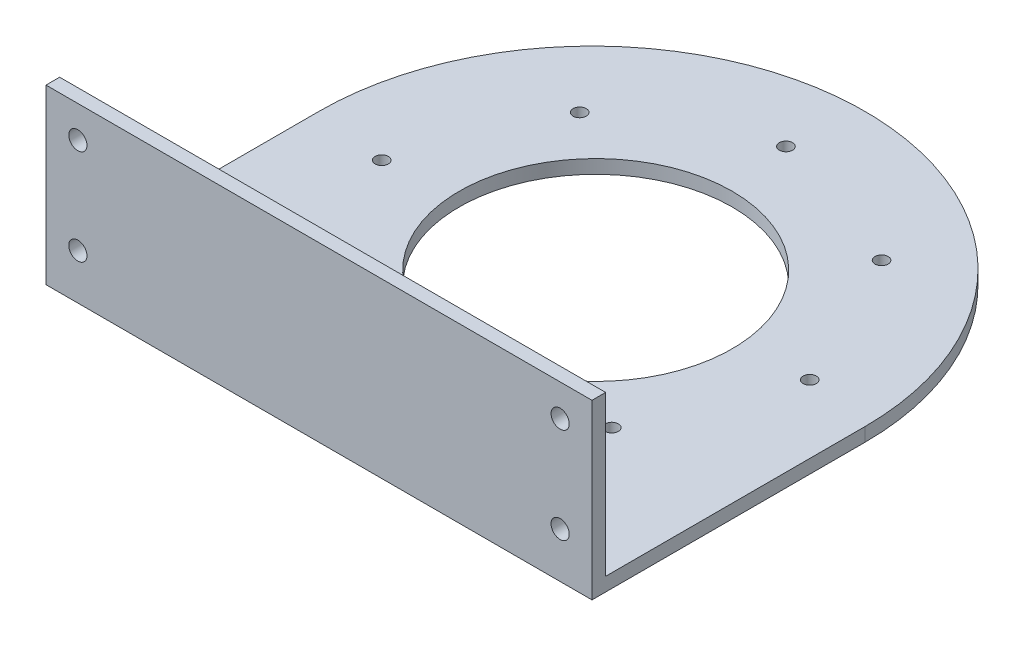
ISO-10303-21;
HEADER;
FILE_DESCRIPTION(('STEP AP214'),'2;1');
FILE_NAME('part.step','',(''),(''),'','','');
FILE_SCHEMA(('AUTOMOTIVE_DESIGN { 1 0 10303 214 1 1 1 1 }'));
ENDSEC;
DATA;
#1=APPLICATION_CONTEXT('core data for automotive mechanical design processes');
#2=APPLICATION_PROTOCOL_DEFINITION('international standard','automotive_design',2000,#1);
#3=PRODUCT_CONTEXT('',#1,'mechanical');
#4=PRODUCT('Part','Part','',(#3));
#5=PRODUCT_RELATED_PRODUCT_CATEGORY('part','',(#4));
#6=PRODUCT_DEFINITION_FORMATION('','',#4);
#7=PRODUCT_DEFINITION_CONTEXT('part definition',#1,'design');
#8=PRODUCT_DEFINITION('design','',#6,#7);
#9=PRODUCT_DEFINITION_SHAPE('','',#8);
#10=(LENGTH_UNIT() NAMED_UNIT(*) SI_UNIT(.MILLI.,.METRE.));
#11=(NAMED_UNIT(*) PLANE_ANGLE_UNIT() SI_UNIT($,.RADIAN.));
#12=(NAMED_UNIT(*) SI_UNIT($,.STERADIAN.) SOLID_ANGLE_UNIT());
#13=UNCERTAINTY_MEASURE_WITH_UNIT(LENGTH_MEASURE(1.E-05),#10,'distance_accuracy_value','');
#14=(GEOMETRIC_REPRESENTATION_CONTEXT(3) GLOBAL_UNCERTAINTY_ASSIGNED_CONTEXT((#13)) GLOBAL_UNIT_ASSIGNED_CONTEXT((#10,
#11,#12)) REPRESENTATION_CONTEXT('',''));
#15=CARTESIAN_POINT('',(0.,0.,0.));
#16=DIRECTION('',(0.,0.,1.));
#17=DIRECTION('',(1.,0.,0.));
#18=AXIS2_PLACEMENT_3D('',#15,#16,#17);
#19=CARTESIAN_POINT('',(60.,3.,0.));
#20=DIRECTION('',(1.,0.,0.));
#21=DIRECTION('',(0.,0.,-1.));
#22=AXIS2_PLACEMENT_3D('',#19,#20,#21);
#23=PLANE('',#22);
#24=DIRECTION('',(0.,0.,1.));
#25=VECTOR('',#24,1.);
#26=CARTESIAN_POINT('',(60.,0.,0.));
#27=LINE('',#26,#25);
#28=CARTESIAN_POINT('',(60.,0.,1.32261852138264E-13));
#29=VERTEX_POINT('',#28);
#30=CARTESIAN_POINT('',(60.,0.,60.));
#31=VERTEX_POINT('',#30);
#32=EDGE_CURVE('E88',#29,#31,#27,.T.);
#33=ORIENTED_EDGE('',*,*,#32,.F.);
#34=DIRECTION('',(0.,-1.,0.));
#35=VECTOR('',#34,1.);
#36=CARTESIAN_POINT('',(60.,3.,1.32261852138264E-13));
#37=LINE('',#36,#35);
#38=CARTESIAN_POINT('',(60.,3.,1.32261852138264E-13));
#39=VERTEX_POINT('',#38);
#40=EDGE_CURVE('E11',#39,#29,#37,.T.);
#41=ORIENTED_EDGE('',*,*,#40,.F.);
#42=DIRECTION('',(0.,0.,1.));
#43=VECTOR('',#42,1.);
#44=CARTESIAN_POINT('',(60.,3.,0.));
#45=LINE('',#44,#43);
#46=CARTESIAN_POINT('',(60.,3.,57.));
#47=VERTEX_POINT('',#46);
#48=EDGE_CURVE('E134',#39,#47,#45,.T.);
#49=ORIENTED_EDGE('',*,*,#48,.T.);
#50=DIRECTION('',(0.,-1.,0.));
#51=VECTOR('',#50,1.);
#52=CARTESIAN_POINT('',(60.,38.,57.));
#53=LINE('',#52,#51);
#54=CARTESIAN_POINT('',(60.,38.,57.));
#55=VERTEX_POINT('',#54);
#56=EDGE_CURVE('E136',#55,#47,#53,.T.);
#57=ORIENTED_EDGE('',*,*,#56,.F.);
#58=DIRECTION('',(0.,0.,-1.));
#59=VECTOR('',#58,1.);
#60=CARTESIAN_POINT('',(60.,38.,60.));
#61=LINE('',#60,#59);
#62=CARTESIAN_POINT('',(60.,38.,60.));
#63=VERTEX_POINT('',#62);
#64=EDGE_CURVE('E92',#63,#55,#61,.T.);
#65=ORIENTED_EDGE('',*,*,#64,.F.);
#66=DIRECTION('',(0.,-1.,0.));
#67=VECTOR('',#66,1.);
#68=CARTESIAN_POINT('',(60.,3.,60.));
#69=LINE('',#68,#67);
#70=EDGE_CURVE('E85',#63,#31,#69,.T.);
#71=ORIENTED_EDGE('',*,*,#70,.T.);
#72=EDGE_LOOP('',(#33,#41,#49,#57,#65,#71));
#73=FACE_BOUND('',#72,.T.);
#74=ADVANCED_FACE('F41',(#73),#23,.T.);
#75=CARTESIAN_POINT('',(0.,3.,0.));
#76=DIRECTION('',(0.,-1.,0.));
#77=DIRECTION('',(0.,0.,-1.));
#78=AXIS2_PLACEMENT_3D('',#75,#76,#77);
#79=CYLINDRICAL_SURFACE('',#78,60.);
#80=CARTESIAN_POINT('',(0.,0.,0.));
#81=DIRECTION('',(0.,1.,0.));
#82=DIRECTION('',(0.,0.,1.));
#83=AXIS2_PLACEMENT_3D('',#80,#81,#82);
#84=CIRCLE('',#83,60.);
#85=CARTESIAN_POINT('',(-60.,0.,0.));
#86=VERTEX_POINT('',#85);
#87=EDGE_CURVE('E112',#29,#86,#84,.T.);
#88=ORIENTED_EDGE('',*,*,#87,.T.);
#89=DIRECTION('',(0.,-1.,0.));
#90=VECTOR('',#89,1.);
#91=CARTESIAN_POINT('',(-60.,3.,0.));
#92=LINE('',#91,#90);
#93=CARTESIAN_POINT('',(-60.,3.,0.));
#94=VERTEX_POINT('',#93);
#95=EDGE_CURVE('E50',#94,#86,#92,.T.);
#96=ORIENTED_EDGE('',*,*,#95,.F.);
#97=CARTESIAN_POINT('',(0.,3.,0.));
#98=DIRECTION('',(0.,1.,0.));
#99=DIRECTION('',(0.,0.,1.));
#100=AXIS2_PLACEMENT_3D('',#97,#98,#99);
#101=CIRCLE('',#100,60.);
#102=EDGE_CURVE('E133',#39,#94,#101,.T.);
#103=ORIENTED_EDGE('',*,*,#102,.F.);
#104=ORIENTED_EDGE('',*,*,#40,.T.);
#105=EDGE_LOOP('',(#88,#96,#103,#104));
#106=FACE_BOUND('',#105,.T.);
#107=ADVANCED_FACE('F132',(#106),#79,.T.);
#108=CARTESIAN_POINT('',(-60.,3.,0.));
#109=DIRECTION('',(1.,0.,0.));
#110=DIRECTION('',(0.,0.,-1.));
#111=AXIS2_PLACEMENT_3D('',#108,#109,#110);
#112=PLANE('',#111);
#113=DIRECTION('',(0.,0.,1.));
#114=VECTOR('',#113,1.);
#115=CARTESIAN_POINT('',(-60.,0.,0.));
#116=LINE('',#115,#114);
#117=CARTESIAN_POINT('',(-60.,0.,60.));
#118=VERTEX_POINT('',#117);
#119=EDGE_CURVE('E107',#86,#118,#116,.T.);
#120=ORIENTED_EDGE('',*,*,#119,.T.);
#121=DIRECTION('',(0.,-1.,0.));
#122=VECTOR('',#121,1.);
#123=CARTESIAN_POINT('',(-60.,3.,60.));
#124=LINE('',#123,#122);
#125=CARTESIAN_POINT('',(-60.,38.,60.));
#126=VERTEX_POINT('',#125);
#127=EDGE_CURVE('E97',#126,#118,#124,.T.);
#128=ORIENTED_EDGE('',*,*,#127,.F.);
#129=DIRECTION('',(0.,0.,-1.));
#130=VECTOR('',#129,1.);
#131=CARTESIAN_POINT('',(-60.,38.,60.));
#132=LINE('',#131,#130);
#133=CARTESIAN_POINT('',(-60.,38.,57.));
#134=VERTEX_POINT('',#133);
#135=EDGE_CURVE('E157',#126,#134,#132,.T.);
#136=ORIENTED_EDGE('',*,*,#135,.T.);
#137=DIRECTION('',(0.,-1.,0.));
#138=VECTOR('',#137,1.);
#139=CARTESIAN_POINT('',(-60.,38.,57.));
#140=LINE('',#139,#138);
#141=CARTESIAN_POINT('',(-60.,3.,57.));
#142=VERTEX_POINT('',#141);
#143=EDGE_CURVE('E153',#134,#142,#140,.T.);
#144=ORIENTED_EDGE('',*,*,#143,.T.);
#145=DIRECTION('',(0.,0.,1.));
#146=VECTOR('',#145,1.);
#147=CARTESIAN_POINT('',(-60.,3.,0.));
#148=LINE('',#147,#146);
#149=EDGE_CURVE('E65',#94,#142,#148,.T.);
#150=ORIENTED_EDGE('',*,*,#149,.F.);
#151=ORIENTED_EDGE('',*,*,#95,.T.);
#152=EDGE_LOOP('',(#120,#128,#136,#144,#150,#151));
#153=FACE_BOUND('',#152,.T.);
#154=ADVANCED_FACE('F129',(#153),#112,.F.);
#155=CARTESIAN_POINT('',(0.61078474716173,3.,-0.20743497162537));
#156=DIRECTION('',(0.,-1.,0.));
#157=DIRECTION('',(0.,0.,-1.));
#158=AXIS2_PLACEMENT_3D('',#155,#156,#157);
#159=CYLINDRICAL_SURFACE('',#158,30.);
#160=CARTESIAN_POINT('',(0.61078474716173,3.,-0.20743497162537));
#161=DIRECTION('',(0.,1.,0.));
#162=DIRECTION('',(0.,0.,1.));
#163=AXIS2_PLACEMENT_3D('',#160,#161,#162);
#164=CIRCLE('',#163,30.);
#165=CARTESIAN_POINT('',(0.61078474716173,3.,29.7925650283746));
#166=VERTEX_POINT('',#165);
#167=EDGE_CURVE('E138',#166,#166,#164,.T.);
#168=ORIENTED_EDGE('',*,*,#167,.T.);
#169=EDGE_LOOP('',(#168));
#170=FACE_BOUND('',#169,.T.);
#171=CARTESIAN_POINT('',(0.61078474716173,0.,-0.20743497162537));
#172=DIRECTION('',(0.,1.,0.));
#173=DIRECTION('',(0.,0.,1.));
#174=AXIS2_PLACEMENT_3D('',#171,#172,#173);
#175=CIRCLE('',#174,30.);
#176=CARTESIAN_POINT('',(0.61078474716173,0.,29.7925650283746));
#177=VERTEX_POINT('',#176);
#178=EDGE_CURVE('E114',#177,#177,#175,.T.);
#179=ORIENTED_EDGE('',*,*,#178,.F.);
#180=EDGE_LOOP('',(#179));
#181=FACE_BOUND('',#180,.T.);
#182=ADVANCED_FACE('F242',(#170,#181),#159,.F.);
#183=CARTESIAN_POINT('',(45.0340985049628,3.,-2.81879377040284));
#184=DIRECTION('',(0.,-1.,0.));
#185=DIRECTION('',(0.,0.,-1.));
#186=AXIS2_PLACEMENT_3D('',#183,#184,#185);
#187=CYLINDRICAL_SURFACE('',#186,1.45000000000024);
#188=CARTESIAN_POINT('',(45.0340985049628,3.,-2.81879377040284));
#189=DIRECTION('',(0.,1.,0.));
#190=DIRECTION('',(0.,0.,1.));
#191=AXIS2_PLACEMENT_3D('',#188,#189,#190);
#192=CIRCLE('',#191,1.45000000000024);
#193=CARTESIAN_POINT('',(45.0340985049628,3.,-1.3687937704026));
#194=VERTEX_POINT('',#193);
#195=EDGE_CURVE('E196',#194,#194,#192,.T.);
#196=ORIENTED_EDGE('',*,*,#195,.T.);
#197=EDGE_LOOP('',(#196));
#198=FACE_BOUND('',#197,.T.);
#199=CARTESIAN_POINT('',(45.0340985049628,0.,-2.81879377040284));
#200=DIRECTION('',(0.,1.,0.));
#201=DIRECTION('',(0.,0.,1.));
#202=AXIS2_PLACEMENT_3D('',#199,#200,#201);
#203=CIRCLE('',#202,1.45000000000024);
#204=CARTESIAN_POINT('',(45.0340985049628,0.,-1.3687937704026));
#205=VERTEX_POINT('',#204);
#206=EDGE_CURVE('E120',#205,#205,#203,.T.);
#207=ORIENTED_EDGE('',*,*,#206,.F.);
#208=EDGE_LOOP('',(#207));
#209=FACE_BOUND('',#208,.T.);
#210=ADVANCED_FACE('F239',(#198,#209),#187,.F.);
#211=CARTESIAN_POINT('',(32.3745550036767,3.,28.0292946387832));
#212=DIRECTION('',(0.,-1.,0.));
#213=DIRECTION('',(0.,0.,-1.));
#214=AXIS2_PLACEMENT_3D('',#211,#212,#213);
#215=CYLINDRICAL_SURFACE('',#214,1.44999999999976);
#216=CARTESIAN_POINT('',(32.3745550036767,3.,28.0292946387832));
#217=DIRECTION('',(0.,1.,0.));
#218=DIRECTION('',(0.,0.,1.));
#219=AXIS2_PLACEMENT_3D('',#216,#217,#218);
#220=CIRCLE('',#219,1.44999999999976);
#221=CARTESIAN_POINT('',(32.3745550036767,3.,29.4792946387829));
#222=VERTEX_POINT('',#221);
#223=EDGE_CURVE('E192',#222,#222,#220,.T.);
#224=ORIENTED_EDGE('',*,*,#223,.T.);
#225=EDGE_LOOP('',(#224));
#226=FACE_BOUND('',#225,.T.);
#227=CARTESIAN_POINT('',(32.3745550036767,0.,28.0292946387832));
#228=DIRECTION('',(0.,1.,0.));
#229=DIRECTION('',(0.,0.,1.));
#230=AXIS2_PLACEMENT_3D('',#227,#228,#229);
#231=CIRCLE('',#230,1.44999999999976);
#232=CARTESIAN_POINT('',(32.3745550036767,0.,29.4792946387829));
#233=VERTEX_POINT('',#232);
#234=EDGE_CURVE('E230',#233,#233,#231,.T.);
#235=ORIENTED_EDGE('',*,*,#234,.F.);
#236=EDGE_LOOP('',(#235));
#237=FACE_BOUND('',#236,.T.);
#238=ADVANCED_FACE('F241',(#226,#237),#215,.F.);
#239=CARTESIAN_POINT('',(3.22214354593799,3.,44.2158787861751));
#240=DIRECTION('',(0.,-1.,0.));
#241=DIRECTION('',(0.,0.,-1.));
#242=AXIS2_PLACEMENT_3D('',#239,#240,#241);
#243=CYLINDRICAL_SURFACE('',#242,1.44999999999974);
#244=CARTESIAN_POINT('',(3.22214354593799,3.,44.2158787861751));
#245=DIRECTION('',(0.,1.,0.));
#246=DIRECTION('',(0.,0.,1.));
#247=AXIS2_PLACEMENT_3D('',#244,#245,#246);
#248=CIRCLE('',#247,1.44999999999974);
#249=CARTESIAN_POINT('',(3.22214354593799,3.,45.6658787861749));
#250=VERTEX_POINT('',#249);
#251=EDGE_CURVE('E188',#250,#250,#248,.T.);
#252=ORIENTED_EDGE('',*,*,#251,.T.);
#253=EDGE_LOOP('',(#252));
#254=FACE_BOUND('',#253,.T.);
#255=CARTESIAN_POINT('',(3.22214354593799,0.,44.2158787861751));
#256=DIRECTION('',(0.,1.,0.));
#257=DIRECTION('',(0.,0.,1.));
#258=AXIS2_PLACEMENT_3D('',#255,#256,#257);
#259=CIRCLE('',#258,1.44999999999974);
#260=CARTESIAN_POINT('',(3.22214354593799,0.,45.6658787861749));
#261=VERTEX_POINT('',#260);
#262=EDGE_CURVE('E226',#261,#261,#259,.T.);
#263=ORIENTED_EDGE('',*,*,#262,.F.);
#264=EDGE_LOOP('',(#263));
#265=FACE_BOUND('',#264,.T.);
#266=ADVANCED_FACE('F249',(#254,#265),#243,.F.);
#267=CARTESIAN_POINT('',(-28.9547321390314,3.,33.0511009440192));
#268=DIRECTION('',(0.,-1.,0.));
#269=DIRECTION('',(0.,0.,-1.));
#270=AXIS2_PLACEMENT_3D('',#267,#268,#269);
#271=CYLINDRICAL_SURFACE('',#270,1.45000000000023);
#272=CARTESIAN_POINT('',(-28.9547321390314,3.,33.0511009440192));
#273=DIRECTION('',(0.,1.,0.));
#274=DIRECTION('',(0.,0.,1.));
#275=AXIS2_PLACEMENT_3D('',#272,#273,#274);
#276=CIRCLE('',#275,1.45000000000023);
#277=CARTESIAN_POINT('',(-28.9547321390314,3.,34.5011009440194));
#278=VERTEX_POINT('',#277);
#279=EDGE_CURVE('E184',#278,#278,#276,.T.);
#280=ORIENTED_EDGE('',*,*,#279,.T.);
#281=EDGE_LOOP('',(#280));
#282=FACE_BOUND('',#281,.T.);
#283=CARTESIAN_POINT('',(-28.9547321390314,0.,33.0511009440192));
#284=DIRECTION('',(0.,1.,0.));
#285=DIRECTION('',(0.,0.,1.));
#286=AXIS2_PLACEMENT_3D('',#283,#284,#285);
#287=CIRCLE('',#286,1.45000000000023);
#288=CARTESIAN_POINT('',(-28.9547321390314,0.,34.5011009440194));
#289=VERTEX_POINT('',#288);
#290=EDGE_CURVE('E222',#289,#289,#287,.T.);
#291=ORIENTED_EDGE('',*,*,#290,.F.);
#292=EDGE_LOOP('',(#291));
#293=FACE_BOUND('',#292,.T.);
#294=ADVANCED_FACE('F442',(#282,#293),#271,.F.);
#295=CARTESIAN_POINT('',(-43.8125290106396,3.,2.40392382715116));
#296=DIRECTION('',(0.,-1.,0.));
#297=DIRECTION('',(0.,0.,-1.));
#298=AXIS2_PLACEMENT_3D('',#295,#296,#297);
#299=CYLINDRICAL_SURFACE('',#298,1.44999999999307);
#300=CARTESIAN_POINT('',(-43.8125290106396,3.,2.40392382715116));
#301=DIRECTION('',(0.,1.,0.));
#302=DIRECTION('',(0.,0.,1.));
#303=AXIS2_PLACEMENT_3D('',#300,#301,#302);
#304=CIRCLE('',#303,1.44999999999307);
#305=CARTESIAN_POINT('',(-43.8125290106396,3.,3.85392382714423));
#306=VERTEX_POINT('',#305);
#307=EDGE_CURVE('E180',#306,#306,#304,.T.);
#308=ORIENTED_EDGE('',*,*,#307,.T.);
#309=EDGE_LOOP('',(#308));
#310=FACE_BOUND('',#309,.T.);
#311=CARTESIAN_POINT('',(-43.8125290106396,0.,2.40392382715116));
#312=DIRECTION('',(0.,1.,0.));
#313=DIRECTION('',(0.,0.,1.));
#314=AXIS2_PLACEMENT_3D('',#311,#312,#313);
#315=CIRCLE('',#314,1.44999999999307);
#316=CARTESIAN_POINT('',(-43.8125290106396,0.,3.85392382714423));
#317=VERTEX_POINT('',#316);
#318=EDGE_CURVE('E218',#317,#317,#315,.T.);
#319=ORIENTED_EDGE('',*,*,#318,.F.);
#320=EDGE_LOOP('',(#319));
#321=FACE_BOUND('',#320,.T.);
#322=ADVANCED_FACE('F434',(#310,#321),#299,.F.);
#323=CARTESIAN_POINT('',(-31.1529855093535,3.,-28.4441645820348));
#324=DIRECTION('',(0.,-1.,0.));
#325=DIRECTION('',(0.,0.,-1.));
#326=AXIS2_PLACEMENT_3D('',#323,#324,#325);
#327=CYLINDRICAL_SURFACE('',#326,1.44999999999972);
#328=CARTESIAN_POINT('',(-31.1529855093535,3.,-28.4441645820348));
#329=DIRECTION('',(0.,1.,0.));
#330=DIRECTION('',(0.,0.,1.));
#331=AXIS2_PLACEMENT_3D('',#328,#329,#330);
#332=CIRCLE('',#331,1.44999999999972);
#333=CARTESIAN_POINT('',(-31.1529855093535,3.,-26.9941645820351));
#334=VERTEX_POINT('',#333);
#335=EDGE_CURVE('E176',#334,#334,#332,.T.);
#336=ORIENTED_EDGE('',*,*,#335,.T.);
#337=EDGE_LOOP('',(#336));
#338=FACE_BOUND('',#337,.T.);
#339=CARTESIAN_POINT('',(-31.1529855093535,0.,-28.4441645820348));
#340=DIRECTION('',(0.,1.,0.));
#341=DIRECTION('',(0.,0.,1.));
#342=AXIS2_PLACEMENT_3D('',#339,#340,#341);
#343=CIRCLE('',#342,1.44999999999972);
#344=CARTESIAN_POINT('',(-31.1529855093535,0.,-26.9941645820351));
#345=VERTEX_POINT('',#344);
#346=EDGE_CURVE('E214',#345,#345,#343,.T.);
#347=ORIENTED_EDGE('',*,*,#346,.F.);
#348=EDGE_LOOP('',(#347));
#349=FACE_BOUND('',#348,.T.);
#350=ADVANCED_FACE('F427',(#338,#349),#327,.F.);
#351=CARTESIAN_POINT('',(-2.00057405161501,3.,-44.6307487294268));
#352=DIRECTION('',(0.,-1.,0.));
#353=DIRECTION('',(0.,0.,-1.));
#354=AXIS2_PLACEMENT_3D('',#351,#352,#353);
#355=CYLINDRICAL_SURFACE('',#354,1.44999999999973);
#356=CARTESIAN_POINT('',(-2.00057405161501,3.,-44.6307487294268));
#357=DIRECTION('',(0.,1.,0.));
#358=DIRECTION('',(0.,0.,1.));
#359=AXIS2_PLACEMENT_3D('',#356,#357,#358);
#360=CIRCLE('',#359,1.44999999999973);
#361=CARTESIAN_POINT('',(-2.00057405161501,3.,-43.1807487294271));
#362=VERTEX_POINT('',#361);
#363=EDGE_CURVE('E172',#362,#362,#360,.T.);
#364=ORIENTED_EDGE('',*,*,#363,.T.);
#365=EDGE_LOOP('',(#364));
#366=FACE_BOUND('',#365,.T.);
#367=CARTESIAN_POINT('',(-2.00057405161501,0.,-44.6307487294268));
#368=DIRECTION('',(0.,1.,0.));
#369=DIRECTION('',(0.,0.,1.));
#370=AXIS2_PLACEMENT_3D('',#367,#368,#369);
#371=CIRCLE('',#370,1.44999999999973);
#372=CARTESIAN_POINT('',(-2.00057405161501,0.,-43.1807487294271));
#373=VERTEX_POINT('',#372);
#374=EDGE_CURVE('E210',#373,#373,#371,.T.);
#375=ORIENTED_EDGE('',*,*,#374,.F.);
#376=EDGE_LOOP('',(#375));
#377=FACE_BOUND('',#376,.T.);
#378=ADVANCED_FACE('F421',(#366,#377),#355,.F.);
#379=CARTESIAN_POINT('',(30.1763016333544,3.,-33.4659708872708));
#380=DIRECTION('',(0.,-1.,0.));
#381=DIRECTION('',(0.,0.,-1.));
#382=AXIS2_PLACEMENT_3D('',#379,#380,#381);
#383=CYLINDRICAL_SURFACE('',#382,1.45000000000024);
#384=CARTESIAN_POINT('',(30.1763016333544,3.,-33.4659708872708));
#385=DIRECTION('',(0.,1.,0.));
#386=DIRECTION('',(0.,0.,1.));
#387=AXIS2_PLACEMENT_3D('',#384,#385,#386);
#388=CIRCLE('',#387,1.45000000000024);
#389=CARTESIAN_POINT('',(30.1763016333544,3.,-32.0159708872706));
#390=VERTEX_POINT('',#389);
#391=EDGE_CURVE('E106',#390,#390,#388,.T.);
#392=ORIENTED_EDGE('',*,*,#391,.T.);
#393=EDGE_LOOP('',(#392));
#394=FACE_BOUND('',#393,.T.);
#395=CARTESIAN_POINT('',(30.1763016333544,0.,-33.4659708872708));
#396=DIRECTION('',(0.,1.,0.));
#397=DIRECTION('',(0.,0.,1.));
#398=AXIS2_PLACEMENT_3D('',#395,#396,#397);
#399=CIRCLE('',#398,1.45000000000024);
#400=CARTESIAN_POINT('',(30.1763016333544,0.,-32.0159708872706));
#401=VERTEX_POINT('',#400);
#402=EDGE_CURVE('E166',#401,#401,#399,.T.);
#403=ORIENTED_EDGE('',*,*,#402,.F.);
#404=EDGE_LOOP('',(#403));
#405=FACE_BOUND('',#404,.T.);
#406=ADVANCED_FACE('F43',(#394,#405),#383,.F.);
#407=CARTESIAN_POINT('',(0.,3.,60.));
#408=DIRECTION('',(0.,0.,-1.));
#409=DIRECTION('',(-1.,0.,0.));
#410=AXIS2_PLACEMENT_3D('',#407,#408,#409);
#411=PLANE('',#410);
#412=CARTESIAN_POINT('',(53.,10.,60.));
#413=DIRECTION('',(0.,0.,-1.));
#414=DIRECTION('',(-1.,0.,0.));
#415=AXIS2_PLACEMENT_3D('',#412,#413,#414);
#416=CIRCLE('',#415,2.);
#417=CARTESIAN_POINT('',(51.,10.,60.));
#418=VERTEX_POINT('',#417);
#419=EDGE_CURVE('E161',#418,#418,#416,.T.);
#420=ORIENTED_EDGE('',*,*,#419,.T.);
#421=EDGE_LOOP('',(#420));
#422=FACE_BOUND('',#421,.T.);
#423=CARTESIAN_POINT('',(-53.,10.,60.));
#424=DIRECTION('',(0.,0.,-1.));
#425=DIRECTION('',(-1.,0.,0.));
#426=AXIS2_PLACEMENT_3D('',#423,#424,#425);
#427=CIRCLE('',#426,2.);
#428=CARTESIAN_POINT('',(-55.,10.,60.));
#429=VERTEX_POINT('',#428);
#430=EDGE_CURVE('E305',#429,#429,#427,.T.);
#431=ORIENTED_EDGE('',*,*,#430,.T.);
#432=EDGE_LOOP('',(#431));
#433=FACE_BOUND('',#432,.T.);
#434=CARTESIAN_POINT('',(-53.,31.,60.));
#435=DIRECTION('',(0.,0.,-1.));
#436=DIRECTION('',(-1.,0.,0.));
#437=AXIS2_PLACEMENT_3D('',#434,#435,#436);
#438=CIRCLE('',#437,2.);
#439=CARTESIAN_POINT('',(-55.,31.,60.));
#440=VERTEX_POINT('',#439);
#441=EDGE_CURVE('E302',#440,#440,#438,.T.);
#442=ORIENTED_EDGE('',*,*,#441,.T.);
#443=EDGE_LOOP('',(#442));
#444=FACE_BOUND('',#443,.T.);
#445=CARTESIAN_POINT('',(53.,31.,60.));
#446=DIRECTION('',(0.,0.,-1.));
#447=DIRECTION('',(-1.,0.,0.));
#448=AXIS2_PLACEMENT_3D('',#445,#446,#447);
#449=CIRCLE('',#448,2.);
#450=CARTESIAN_POINT('',(51.,31.,60.));
#451=VERTEX_POINT('',#450);
#452=EDGE_CURVE('E306',#451,#451,#449,.T.);
#453=ORIENTED_EDGE('',*,*,#452,.T.);
#454=EDGE_LOOP('',(#453));
#455=FACE_BOUND('',#454,.T.);
#456=DIRECTION('',(1.,0.,0.));
#457=VECTOR('',#456,1.);
#458=CARTESIAN_POINT('',(0.,0.,60.));
#459=LINE('',#458,#457);
#460=EDGE_CURVE('E100',#118,#31,#459,.T.);
#461=ORIENTED_EDGE('',*,*,#460,.T.);
#462=ORIENTED_EDGE('',*,*,#70,.F.);
#463=DIRECTION('',(-1.,0.,0.));
#464=VECTOR('',#463,1.);
#465=CARTESIAN_POINT('',(60.,38.,60.));
#466=LINE('',#465,#464);
#467=EDGE_CURVE('E148',#63,#126,#466,.T.);
#468=ORIENTED_EDGE('',*,*,#467,.T.);
#469=ORIENTED_EDGE('',*,*,#127,.T.);
#470=EDGE_LOOP('',(#461,#462,#468,#469));
#471=FACE_BOUND('',#470,.T.);
#472=ADVANCED_FACE('F101',(#422,#433,#444,#455,#471),#411,.F.);
#473=CARTESIAN_POINT('',(0.,3.,0.));
#474=DIRECTION('',(0.,1.,0.));
#475=DIRECTION('',(0.,0.,1.));
#476=AXIS2_PLACEMENT_3D('',#473,#474,#475);
#477=PLANE('',#476);
#478=DIRECTION('',(-1.,0.,0.));
#479=VECTOR('',#478,1.);
#480=CARTESIAN_POINT('',(60.,3.,57.));
#481=LINE('',#480,#479);
#482=EDGE_CURVE('E57',#47,#142,#481,.T.);
#483=ORIENTED_EDGE('',*,*,#482,.F.);
#484=ORIENTED_EDGE('',*,*,#48,.F.);
#485=ORIENTED_EDGE('',*,*,#102,.T.);
#486=ORIENTED_EDGE('',*,*,#149,.T.);
#487=EDGE_LOOP('',(#483,#484,#485,#486));
#488=FACE_BOUND('',#487,.T.);
#489=ORIENTED_EDGE('',*,*,#391,.F.);
#490=EDGE_LOOP('',(#489));
#491=FACE_BOUND('',#490,.T.);
#492=ORIENTED_EDGE('',*,*,#363,.F.);
#493=EDGE_LOOP('',(#492));
#494=FACE_BOUND('',#493,.T.);
#495=ORIENTED_EDGE('',*,*,#335,.F.);
#496=EDGE_LOOP('',(#495));
#497=FACE_BOUND('',#496,.T.);
#498=ORIENTED_EDGE('',*,*,#307,.F.);
#499=EDGE_LOOP('',(#498));
#500=FACE_BOUND('',#499,.T.);
#501=ORIENTED_EDGE('',*,*,#279,.F.);
#502=EDGE_LOOP('',(#501));
#503=FACE_BOUND('',#502,.T.);
#504=ORIENTED_EDGE('',*,*,#251,.F.);
#505=EDGE_LOOP('',(#504));
#506=FACE_BOUND('',#505,.T.);
#507=ORIENTED_EDGE('',*,*,#223,.F.);
#508=EDGE_LOOP('',(#507));
#509=FACE_BOUND('',#508,.T.);
#510=ORIENTED_EDGE('',*,*,#195,.F.);
#511=EDGE_LOOP('',(#510));
#512=FACE_BOUND('',#511,.T.);
#513=ORIENTED_EDGE('',*,*,#167,.F.);
#514=EDGE_LOOP('',(#513));
#515=FACE_BOUND('',#514,.T.);
#516=ADVANCED_FACE('F265',(#488,#491,#494,#497,#500,#503,#506,#509,#512,#515),#477,.T.);
#517=CARTESIAN_POINT('',(0.,0.,0.));
#518=DIRECTION('',(0.,1.,0.));
#519=DIRECTION('',(0.,0.,1.));
#520=AXIS2_PLACEMENT_3D('',#517,#518,#519);
#521=PLANE('',#520);
#522=ORIENTED_EDGE('',*,*,#402,.T.);
#523=EDGE_LOOP('',(#522));
#524=FACE_BOUND('',#523,.T.);
#525=ORIENTED_EDGE('',*,*,#374,.T.);
#526=EDGE_LOOP('',(#525));
#527=FACE_BOUND('',#526,.T.);
#528=ORIENTED_EDGE('',*,*,#346,.T.);
#529=EDGE_LOOP('',(#528));
#530=FACE_BOUND('',#529,.T.);
#531=ORIENTED_EDGE('',*,*,#318,.T.);
#532=EDGE_LOOP('',(#531));
#533=FACE_BOUND('',#532,.T.);
#534=ORIENTED_EDGE('',*,*,#290,.T.);
#535=EDGE_LOOP('',(#534));
#536=FACE_BOUND('',#535,.T.);
#537=ORIENTED_EDGE('',*,*,#262,.T.);
#538=EDGE_LOOP('',(#537));
#539=FACE_BOUND('',#538,.T.);
#540=ORIENTED_EDGE('',*,*,#234,.T.);
#541=EDGE_LOOP('',(#540));
#542=FACE_BOUND('',#541,.T.);
#543=ORIENTED_EDGE('',*,*,#206,.T.);
#544=EDGE_LOOP('',(#543));
#545=FACE_BOUND('',#544,.T.);
#546=ORIENTED_EDGE('',*,*,#178,.T.);
#547=EDGE_LOOP('',(#546));
#548=FACE_BOUND('',#547,.T.);
#549=ORIENTED_EDGE('',*,*,#32,.T.);
#550=ORIENTED_EDGE('',*,*,#460,.F.);
#551=ORIENTED_EDGE('',*,*,#119,.F.);
#552=ORIENTED_EDGE('',*,*,#87,.F.);
#553=EDGE_LOOP('',(#549,#550,#551,#552));
#554=FACE_BOUND('',#553,.T.);
#555=ADVANCED_FACE('F110',(#524,#527,#530,#533,#536,#539,#542,#545,#548,#554),#521,.F.);
#556=CARTESIAN_POINT('',(60.,38.,57.));
#557=DIRECTION('',(0.,0.,-1.));
#558=DIRECTION('',(-1.,0.,0.));
#559=AXIS2_PLACEMENT_3D('',#556,#557,#558);
#560=PLANE('',#559);
#561=CARTESIAN_POINT('',(53.,10.,57.));
#562=DIRECTION('',(0.,0.,-1.));
#563=DIRECTION('',(1.,0.,0.));
#564=AXIS2_PLACEMENT_3D('',#561,#562,#563);
#565=CIRCLE('',#564,2.);
#566=CARTESIAN_POINT('',(55.,10.,57.));
#567=VERTEX_POINT('',#566);
#568=EDGE_CURVE('E329',#567,#567,#565,.T.);
#569=ORIENTED_EDGE('',*,*,#568,.F.);
#570=EDGE_LOOP('',(#569));
#571=FACE_BOUND('',#570,.T.);
#572=CARTESIAN_POINT('',(-53.,10.,57.));
#573=DIRECTION('',(0.,0.,-1.));
#574=DIRECTION('',(-1.,0.,0.));
#575=AXIS2_PLACEMENT_3D('',#572,#573,#574);
#576=CIRCLE('',#575,2.);
#577=CARTESIAN_POINT('',(-55.,10.,57.));
#578=VERTEX_POINT('',#577);
#579=EDGE_CURVE('E333',#578,#578,#576,.T.);
#580=ORIENTED_EDGE('',*,*,#579,.F.);
#581=EDGE_LOOP('',(#580));
#582=FACE_BOUND('',#581,.T.);
#583=CARTESIAN_POINT('',(-53.,31.,57.));
#584=DIRECTION('',(0.,0.,-1.));
#585=DIRECTION('',(1.,0.,0.));
#586=AXIS2_PLACEMENT_3D('',#583,#584,#585);
#587=CIRCLE('',#586,2.);
#588=CARTESIAN_POINT('',(-51.,31.,57.));
#589=VERTEX_POINT('',#588);
#590=EDGE_CURVE('E299',#589,#589,#587,.T.);
#591=ORIENTED_EDGE('',*,*,#590,.F.);
#592=EDGE_LOOP('',(#591));
#593=FACE_BOUND('',#592,.T.);
#594=CARTESIAN_POINT('',(53.,31.,57.));
#595=DIRECTION('',(0.,0.,-1.));
#596=DIRECTION('',(-1.,0.,0.));
#597=AXIS2_PLACEMENT_3D('',#594,#595,#596);
#598=CIRCLE('',#597,2.);
#599=CARTESIAN_POINT('',(51.,31.,57.));
#600=VERTEX_POINT('',#599);
#601=EDGE_CURVE('E313',#600,#600,#598,.T.);
#602=ORIENTED_EDGE('',*,*,#601,.F.);
#603=EDGE_LOOP('',(#602));
#604=FACE_BOUND('',#603,.T.);
#605=ORIENTED_EDGE('',*,*,#143,.F.);
#606=DIRECTION('',(-1.,0.,0.));
#607=VECTOR('',#606,1.);
#608=CARTESIAN_POINT('',(60.,38.,57.));
#609=LINE('',#608,#607);
#610=EDGE_CURVE('E146',#55,#134,#609,.T.);
#611=ORIENTED_EDGE('',*,*,#610,.F.);
#612=ORIENTED_EDGE('',*,*,#56,.T.);
#613=ORIENTED_EDGE('',*,*,#482,.T.);
#614=EDGE_LOOP('',(#605,#611,#612,#613));
#615=FACE_BOUND('',#614,.T.);
#616=ADVANCED_FACE('F143',(#571,#582,#593,#604,#615),#560,.T.);
#617=CARTESIAN_POINT('',(60.,38.,60.));
#618=DIRECTION('',(0.,1.,0.));
#619=DIRECTION('',(0.,0.,1.));
#620=AXIS2_PLACEMENT_3D('',#617,#618,#619);
#621=PLANE('',#620);
#622=ORIENTED_EDGE('',*,*,#135,.F.);
#623=ORIENTED_EDGE('',*,*,#467,.F.);
#624=ORIENTED_EDGE('',*,*,#64,.T.);
#625=ORIENTED_EDGE('',*,*,#610,.T.);
#626=EDGE_LOOP('',(#622,#623,#624,#625));
#627=FACE_BOUND('',#626,.T.);
#628=ADVANCED_FACE('F272',(#627),#621,.T.);
#629=CARTESIAN_POINT('',(53.,31.,67.));
#630=DIRECTION('',(0.,0.,-1.));
#631=DIRECTION('',(-1.,0.,0.));
#632=AXIS2_PLACEMENT_3D('',#629,#630,#631);
#633=CYLINDRICAL_SURFACE('',#632,2.);
#634=ORIENTED_EDGE('',*,*,#601,.T.);
#635=EDGE_LOOP('',(#634));
#636=FACE_BOUND('',#635,.T.);
#637=ORIENTED_EDGE('',*,*,#452,.F.);
#638=EDGE_LOOP('',(#637));
#639=FACE_BOUND('',#638,.T.);
#640=ADVANCED_FACE('F275',(#636,#639),#633,.F.);
#641=CARTESIAN_POINT('',(-53.,31.,67.));
#642=DIRECTION('',(0.,0.,-1.));
#643=DIRECTION('',(-1.,0.,0.));
#644=AXIS2_PLACEMENT_3D('',#641,#642,#643);
#645=CYLINDRICAL_SURFACE('',#644,2.);
#646=ORIENTED_EDGE('',*,*,#590,.T.);
#647=EDGE_LOOP('',(#646));
#648=FACE_BOUND('',#647,.T.);
#649=ORIENTED_EDGE('',*,*,#441,.F.);
#650=EDGE_LOOP('',(#649));
#651=FACE_BOUND('',#650,.T.);
#652=ADVANCED_FACE('F282',(#648,#651),#645,.F.);
#653=CARTESIAN_POINT('',(-53.,10.,67.));
#654=DIRECTION('',(0.,0.,-1.));
#655=DIRECTION('',(-1.,0.,0.));
#656=AXIS2_PLACEMENT_3D('',#653,#654,#655);
#657=CYLINDRICAL_SURFACE('',#656,2.);
#658=ORIENTED_EDGE('',*,*,#579,.T.);
#659=EDGE_LOOP('',(#658));
#660=FACE_BOUND('',#659,.T.);
#661=ORIENTED_EDGE('',*,*,#430,.F.);
#662=EDGE_LOOP('',(#661));
#663=FACE_BOUND('',#662,.T.);
#664=ADVANCED_FACE('F287',(#660,#663),#657,.F.);
#665=CARTESIAN_POINT('',(53.,10.,67.));
#666=DIRECTION('',(0.,0.,-1.));
#667=DIRECTION('',(-1.,0.,0.));
#668=AXIS2_PLACEMENT_3D('',#665,#666,#667);
#669=CYLINDRICAL_SURFACE('',#668,2.);
#670=ORIENTED_EDGE('',*,*,#568,.T.);
#671=EDGE_LOOP('',(#670));
#672=FACE_BOUND('',#671,.T.);
#673=ORIENTED_EDGE('',*,*,#419,.F.);
#674=EDGE_LOOP('',(#673));
#675=FACE_BOUND('',#674,.T.);
#676=ADVANCED_FACE('F284',(#672,#675),#669,.F.);
#677=CLOSED_SHELL('',(#74,#107,#154,#182,#210,#238,#266,#294,#322,#350,#378,#406,#472,#516,#555,
#616,#628,#640,#652,#664,#676));
#678=MANIFOLD_SOLID_BREP('B2',#677);
#679=ADVANCED_BREP_SHAPE_REPRESENTATION('',(#18,#678),#14);
#680=SHAPE_DEFINITION_REPRESENTATION(#9,#679);
ENDSEC;
END-ISO-10303-21;
